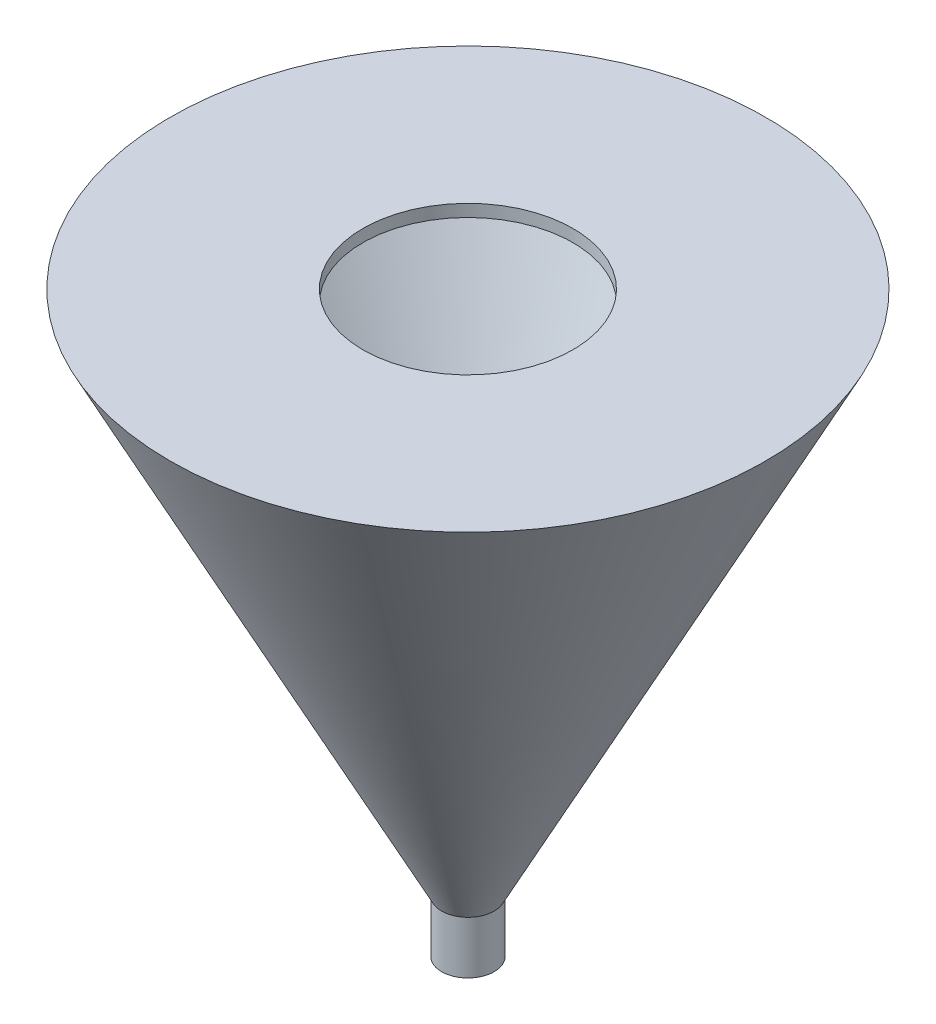
ISO-10303-21;
HEADER;
FILE_DESCRIPTION(('STEP AP214'),'2;1');
FILE_NAME('part.step','',(''),(''),'','','');
FILE_SCHEMA(('AUTOMOTIVE_DESIGN { 1 0 10303 214 1 1 1 1 }'));
ENDSEC;
DATA;
#1=APPLICATION_CONTEXT('core data for automotive mechanical design processes');
#2=APPLICATION_PROTOCOL_DEFINITION('international standard','automotive_design',2000,#1);
#3=PRODUCT_CONTEXT('',#1,'mechanical');
#4=PRODUCT('Part','Part','',(#3));
#5=PRODUCT_RELATED_PRODUCT_CATEGORY('part','',(#4));
#6=PRODUCT_DEFINITION_FORMATION('','',#4);
#7=PRODUCT_DEFINITION_CONTEXT('part definition',#1,'design');
#8=PRODUCT_DEFINITION('design','',#6,#7);
#9=PRODUCT_DEFINITION_SHAPE('','',#8);
#10=(LENGTH_UNIT() NAMED_UNIT(*) SI_UNIT(.MILLI.,.METRE.));
#11=(NAMED_UNIT(*) PLANE_ANGLE_UNIT() SI_UNIT($,.RADIAN.));
#12=(NAMED_UNIT(*) SI_UNIT($,.STERADIAN.) SOLID_ANGLE_UNIT());
#13=UNCERTAINTY_MEASURE_WITH_UNIT(LENGTH_MEASURE(1.E-05),#10,'distance_accuracy_value','');
#14=(GEOMETRIC_REPRESENTATION_CONTEXT(3) GLOBAL_UNCERTAINTY_ASSIGNED_CONTEXT((#13)) GLOBAL_UNIT_ASSIGNED_CONTEXT((#10,
#11,#12)) REPRESENTATION_CONTEXT('',''));
#15=CARTESIAN_POINT('',(0.,0.,0.));
#16=DIRECTION('',(0.,0.,1.));
#17=DIRECTION('',(1.,0.,0.));
#18=AXIS2_PLACEMENT_3D('',#15,#16,#17);
#19=CARTESIAN_POINT('',(0.,51.2913461986501,0.));
#20=DIRECTION('',(0.,1.,0.));
#21=DIRECTION('',(0.,0.,1.));
#22=AXIS2_PLACEMENT_3D('',#19,#20,#21);
#23=CYLINDRICAL_SURFACE('',#22,4.5);
#24=CARTESIAN_POINT('',(0.,16.8184876151176,0.));
#25=DIRECTION('',(0.,1.,0.));
#26=DIRECTION('',(0.,0.,1.));
#27=AXIS2_PLACEMENT_3D('',#24,#25,#26);
#28=CIRCLE('',#27,4.5);
#29=CARTESIAN_POINT('',(0.,16.8184876151176,4.5));
#30=VERTEX_POINT('',#29);
#31=EDGE_CURVE('E10',#30,#30,#28,.T.);
#32=ORIENTED_EDGE('',*,*,#31,.T.);
#33=EDGE_LOOP('',(#32));
#34=FACE_BOUND('',#33,.T.);
#35=CARTESIAN_POINT('',(0.,0.,0.));
#36=DIRECTION('',(0.,1.,0.));
#37=DIRECTION('',(0.,0.,1.));
#38=AXIS2_PLACEMENT_3D('',#35,#36,#37);
#39=CIRCLE('',#38,4.5);
#40=CARTESIAN_POINT('',(0.,0.,4.5));
#41=VERTEX_POINT('',#40);
#42=EDGE_CURVE('E72',#41,#41,#39,.T.);
#43=ORIENTED_EDGE('',*,*,#42,.F.);
#44=EDGE_LOOP('',(#43));
#45=FACE_BOUND('',#44,.T.);
#46=ADVANCED_FACE('F37',(#34,#45),#23,.F.);
#47=CARTESIAN_POINT('',(0.,16.8184876151176,0.));
#48=DIRECTION('',(0.,1.,0.));
#49=DIRECTION('',(0.,0.,1.));
#50=AXIS2_PLACEMENT_3D('',#47,#48,#49);
#51=CONICAL_SURFACE('',#50,4.5,0.476891867665535);
#52=CARTESIAN_POINT('',(0.,161.5,0.));
#53=DIRECTION('',(0.,1.,0.));
#54=DIRECTION('',(0.,0.,1.));
#55=AXIS2_PLACEMENT_3D('',#52,#53,#54);
#56=CIRCLE('',#55,79.2521147321893);
#57=CARTESIAN_POINT('',(0.,161.5,79.2521147321893));
#58=VERTEX_POINT('',#57);
#59=EDGE_CURVE('E44',#58,#58,#56,.T.);
#60=CARTESIAN_POINT('',(0.,161.5,79.2521147321893));
#61=CARTESIAN_POINT('',(0.,159.992900912657,78.4734468703956));
#62=CARTESIAN_POINT('',(0.,158.485801825315,77.694779008602));
#63=CARTESIAN_POINT('',(0.,155.47160365063,76.1374432850147));
#64=CARTESIAN_POINT('',(0.,153.964504563287,75.3587754232211));
#65=CARTESIAN_POINT('',(0.,150.950306388602,73.8014396996338));
#66=CARTESIAN_POINT('',(0.,149.44320730126,73.0227718378402));
#67=CARTESIAN_POINT('',(0.,146.429009126575,71.4654361142529));
#68=CARTESIAN_POINT('',(0.,144.921910039232,70.6867682524592));
#69=CARTESIAN_POINT('',(0.,141.907711864547,69.129432528872));
#70=CARTESIAN_POINT('',(0.,140.400612777205,68.3507646670784));
#71=CARTESIAN_POINT('',(0.,137.38641460252,66.7934289434911));
#72=CARTESIAN_POINT('',(0.,135.879315515177,66.0147610816974));
#73=CARTESIAN_POINT('',(0.,132.865117340492,64.4574253581101));
#74=CARTESIAN_POINT('',(0.,131.358018253149,63.6787574963165));
#75=CARTESIAN_POINT('',(0.,128.343820078464,62.1214217727292));
#76=CARTESIAN_POINT('',(0.,126.836720991122,61.3427539109356));
#77=CARTESIAN_POINT('',(0.,123.822522816437,59.7854181873483));
#78=CARTESIAN_POINT('',(0.,122.315423729094,59.0067503255547));
#79=CARTESIAN_POINT('',(0.,119.301225554409,57.4494146019674));
#80=CARTESIAN_POINT('',(0.,117.794126467067,56.6707467401738));
#81=CARTESIAN_POINT('',(0.,114.779928292382,55.1134110165865));
#82=CARTESIAN_POINT('',(0.,113.272829205039,54.3347431547928));
#83=CARTESIAN_POINT('',(0.,110.258631030354,52.7774074312056));
#84=CARTESIAN_POINT('',(0.,108.751531943012,51.9987395694119));
#85=CARTESIAN_POINT('',(0.,105.737333768327,50.4414038458247));
#86=CARTESIAN_POINT('',(0.,104.230234680984,49.662735984031));
#87=CARTESIAN_POINT('',(0.,101.216036506299,48.1054002604437));
#88=CARTESIAN_POINT('',(0.,99.7089374189565,47.3267323986501));
#89=CARTESIAN_POINT('',(0.,96.6947392442714,45.7693966750628));
#90=CARTESIAN_POINT('',(0.,95.1876401569289,44.9907288132692));
#91=CARTESIAN_POINT('',(0.,92.1734419822438,43.4333930896819));
#92=CARTESIAN_POINT('',(0.,90.6663428949013,42.6547252278883));
#93=CARTESIAN_POINT('',(0.,87.6521447202163,41.097389504301));
#94=CARTESIAN_POINT('',(0.,86.1450456328737,40.3187216425074));
#95=CARTESIAN_POINT('',(0.,83.1308474581887,38.7613859189201));
#96=CARTESIAN_POINT('',(0.,81.6237483708462,37.9827180571264));
#97=CARTESIAN_POINT('',(0.,78.6095501961611,36.4253823335392));
#98=CARTESIAN_POINT('',(0.,77.1024511088186,35.6467144717455));
#99=CARTESIAN_POINT('',(0.,74.0882529341335,34.0893787481582));
#100=CARTESIAN_POINT('',(0.,72.581153846791,33.3107108863646));
#101=CARTESIAN_POINT('',(0.,69.566955672106,31.7533751627773));
#102=CARTESIAN_POINT('',(0.,68.0598565847635,30.9747073009837));
#103=CARTESIAN_POINT('',(0.,65.0456584100784,29.4173715773964));
#104=CARTESIAN_POINT('',(0.,63.5385593227359,28.6387037156028));
#105=CARTESIAN_POINT('',(0.,60.5243611480508,27.0813679920155));
#106=CARTESIAN_POINT('',(0.,59.0172620607083,26.3027001302219));
#107=CARTESIAN_POINT('',(0.,56.0030638860233,24.7453644066346));
#108=CARTESIAN_POINT('',(0.,54.4959647986807,23.966696544841));
#109=CARTESIAN_POINT('',(0.,51.4817666239957,22.4093608212537));
#110=CARTESIAN_POINT('',(0.,49.9746675366532,21.63069295946));
#111=CARTESIAN_POINT('',(0.,46.9604693619681,20.0733572358728));
#112=CARTESIAN_POINT('',(0.,45.4533702746256,19.2946893740791));
#113=CARTESIAN_POINT('',(0.,42.4391720999405,17.7373536504918));
#114=CARTESIAN_POINT('',(0.,40.932073012598,16.9586857886982));
#115=CARTESIAN_POINT('',(0.,37.917874837913,15.4013500651109));
#116=CARTESIAN_POINT('',(0.,36.4107757505704,14.6226822033173));
#117=CARTESIAN_POINT('',(0.,33.3965775758854,13.06534647973));
#118=CARTESIAN_POINT('',(0.,31.8894784885429,12.2866786179364));
#119=CARTESIAN_POINT('',(0.,28.8752803138578,10.7293428943491));
#120=CARTESIAN_POINT('',(0.,27.3681812265153,9.95067503255547));
#121=CARTESIAN_POINT('',(0.,24.3539830518302,8.39333930896819));
#122=CARTESIAN_POINT('',(0.,22.8468839644877,7.61467144717455));
#123=CARTESIAN_POINT('',(0.,19.8326857898027,6.05733572358728));
#124=CARTESIAN_POINT('',(0.,18.3255867024601,5.27866786179364));
#125=CARTESIAN_POINT('',(0.,16.8184876151176,4.5));
#126=B_SPLINE_CURVE_WITH_KNOTS('',3,(#60,#61,#62,#63,#64,#65,#66,#67,#68,#69,#70,#71,#72,#73,
#74,#75,#76,#77,#78,#79,#80,#81,#82,#83,#84,#85,#86,#87,#88,#89,#90,#91,#92,#93,#94,#95,#96,#97,
#98,#99,#100,#101,#102,#103,#104,#105,#106,#107,#108,#109,#110,#111,#112,#113,#114,#115,#116,
#117,#118,#119,#120,#121,#122,#123,#124,#125),.UNSPECIFIED.,.F.,.F.,(4,2,2,2,2,2,2,2,2,2,2,2,2,
2,2,2,2,2,2,2,2,2,2,2,2,2,2,2,2,2,2,2,4),(0.,5.08911010713371,10.1782202142674,15.2673303214011,
20.3564404285349,25.4455505356686,30.5346606428023,35.623770749936,40.7128808570697,
45.8019909642034,50.8911010713371,55.9802111784709,61.0693212856046,66.1584313927383,
71.247541499872,76.3366516070057,81.4257617141394,86.5148718212731,91.6039819284069,
96.6930920355406,101.782202142674,106.871312249808,111.960422356942,117.049532464075,
122.138642571209,127.227752678343,132.316862785477,137.40597289261,142.495082999744,
147.584193106878,152.673303214011,157.762413321145,162.851523428279),.UNSPECIFIED.);
#127=EDGE_CURVE('BSEAM81',#58,#30,#126,.T.);
#128=ORIENTED_EDGE('',*,*,#59,.T.);
#129=ORIENTED_EDGE('',*,*,#31,.F.);
#130=ORIENTED_EDGE('',*,*,#127,.T.);
#131=ORIENTED_EDGE('',*,*,#127,.F.);
#132=EDGE_LOOP('',(#128,#130,#129,#131));
#133=FACE_BOUND('',#132,.T.);
#134=ADVANCED_FACE('F81',(#133),#51,.F.);
#135=CARTESIAN_POINT('',(-30.,161.5,0.));
#136=DIRECTION('',(0.,-1.,0.));
#137=DIRECTION('',(0.,0.,-1.));
#138=AXIS2_PLACEMENT_3D('',#135,#136,#137);
#139=PLANE('',#138);
#140=CARTESIAN_POINT('',(0.,161.5,0.));
#141=DIRECTION('',(0.,1.,0.));
#142=DIRECTION('',(0.,0.,1.));
#143=AXIS2_PLACEMENT_3D('',#140,#141,#142);
#144=CIRCLE('',#143,30.);
#145=CARTESIAN_POINT('',(0.,161.5,30.));
#146=VERTEX_POINT('',#145);
#147=EDGE_CURVE('E49',#146,#146,#144,.T.);
#148=ORIENTED_EDGE('',*,*,#147,.T.);
#149=EDGE_LOOP('',(#148));
#150=FACE_BOUND('',#149,.T.);
#151=ORIENTED_EDGE('',*,*,#59,.F.);
#152=EDGE_LOOP('',(#151));
#153=FACE_BOUND('',#152,.T.);
#154=ADVANCED_FACE('F85',(#150,#153),#139,.T.);
#155=CARTESIAN_POINT('',(0.,51.2913461986501,0.));
#156=DIRECTION('',(0.,1.,0.));
#157=DIRECTION('',(0.,0.,1.));
#158=AXIS2_PLACEMENT_3D('',#155,#156,#157);
#159=CYLINDRICAL_SURFACE('',#158,30.);
#160=CARTESIAN_POINT('',(0.,165.,0.));
#161=DIRECTION('',(0.,1.,0.));
#162=DIRECTION('',(0.,0.,1.));
#163=AXIS2_PLACEMENT_3D('',#160,#161,#162);
#164=CIRCLE('',#163,30.);
#165=CARTESIAN_POINT('',(0.,165.,30.));
#166=VERTEX_POINT('',#165);
#167=EDGE_CURVE('E54',#166,#166,#164,.T.);
#168=ORIENTED_EDGE('',*,*,#167,.T.);
#169=EDGE_LOOP('',(#168));
#170=FACE_BOUND('',#169,.T.);
#171=ORIENTED_EDGE('',*,*,#147,.F.);
#172=EDGE_LOOP('',(#171));
#173=FACE_BOUND('',#172,.T.);
#174=ADVANCED_FACE('F89',(#170,#173),#159,.F.);
#175=CARTESIAN_POINT('',(-85.,165.,0.));
#176=DIRECTION('',(0.,1.,0.));
#177=DIRECTION('',(0.,0.,1.));
#178=AXIS2_PLACEMENT_3D('',#175,#176,#177);
#179=PLANE('',#178);
#180=CARTESIAN_POINT('',(0.,165.,0.));
#181=DIRECTION('',(0.,1.,0.));
#182=DIRECTION('',(0.,0.,1.));
#183=AXIS2_PLACEMENT_3D('',#180,#181,#182);
#184=CIRCLE('',#183,85.);
#185=CARTESIAN_POINT('',(0.,165.,85.));
#186=VERTEX_POINT('',#185);
#187=EDGE_CURVE('E60',#186,#186,#184,.T.);
#188=ORIENTED_EDGE('',*,*,#187,.T.);
#189=EDGE_LOOP('',(#188));
#190=FACE_BOUND('',#189,.T.);
#191=ORIENTED_EDGE('',*,*,#167,.F.);
#192=EDGE_LOOP('',(#191));
#193=FACE_BOUND('',#192,.T.);
#194=ADVANCED_FACE('F96',(#190,#193),#179,.T.);
#195=CARTESIAN_POINT('',(0.,165.,0.));
#196=DIRECTION('',(0.,1.,0.));
#197=DIRECTION('',(0.,0.,1.));
#198=AXIS2_PLACEMENT_3D('',#195,#196,#197);
#199=CONICAL_SURFACE('',#198,85.,0.476891867665535);
#200=CARTESIAN_POINT('',(0.,15.,0.));
#201=DIRECTION('',(0.,1.,0.));
#202=DIRECTION('',(0.,0.,1.));
#203=AXIS2_PLACEMENT_3D('',#200,#201,#202);
#204=CIRCLE('',#203,7.5);
#205=CARTESIAN_POINT('',(0.,15.,7.50000000000001));
#206=VERTEX_POINT('',#205);
#207=EDGE_CURVE('E64',#206,#206,#204,.T.);
#208=CARTESIAN_POINT('',(0.,15.,7.50000000000001));
#209=CARTESIAN_POINT('',(0.,16.5625,8.30729166666668));
#210=CARTESIAN_POINT('',(0.,18.125,9.11458333333336));
#211=CARTESIAN_POINT('',(0.,21.25,10.7291666666667));
#212=CARTESIAN_POINT('',(0.,22.8125,11.5364583333334));
#213=CARTESIAN_POINT('',(0.,25.9375,13.1510416666667));
#214=CARTESIAN_POINT('',(0.,27.5,13.9583333333333));
#215=CARTESIAN_POINT('',(0.,30.625,15.5729166666667));
#216=CARTESIAN_POINT('',(0.,32.1875,16.3802083333333));
#217=CARTESIAN_POINT('',(0.,35.3125,17.9947916666667));
#218=CARTESIAN_POINT('',(0.,36.875,18.8020833333333));
#219=CARTESIAN_POINT('',(0.,40.,20.4166666666667));
#220=CARTESIAN_POINT('',(0.,41.5625,21.2239583333333));
#221=CARTESIAN_POINT('',(0.,44.6875,22.8385416666667));
#222=CARTESIAN_POINT('',(0.,46.25,23.6458333333333));
#223=CARTESIAN_POINT('',(0.,49.375,25.2604166666667));
#224=CARTESIAN_POINT('',(0.,50.9375,26.0677083333333));
#225=CARTESIAN_POINT('',(0.,54.0625,27.6822916666667));
#226=CARTESIAN_POINT('',(0.,55.625,28.4895833333333));
#227=CARTESIAN_POINT('',(0.,58.75,30.1041666666667));
#228=CARTESIAN_POINT('',(0.,60.3125,30.9114583333333));
#229=CARTESIAN_POINT('',(0.,63.4375,32.5260416666667));
#230=CARTESIAN_POINT('',(0.,65.,33.3333333333333));
#231=CARTESIAN_POINT('',(0.,68.125,34.9479166666667));
#232=CARTESIAN_POINT('',(0.,69.6875,35.7552083333333));
#233=CARTESIAN_POINT('',(0.,72.8125,37.3697916666667));
#234=CARTESIAN_POINT('',(0.,74.375,38.1770833333333));
#235=CARTESIAN_POINT('',(0.,77.5,39.7916666666667));
#236=CARTESIAN_POINT('',(0.,79.0625,40.5989583333333));
#237=CARTESIAN_POINT('',(0.,82.1875,42.2135416666667));
#238=CARTESIAN_POINT('',(0.,83.75,43.0208333333333));
#239=CARTESIAN_POINT('',(0.,86.875,44.6354166666667));
#240=CARTESIAN_POINT('',(0.,88.4375,45.4427083333333));
#241=CARTESIAN_POINT('',(0.,91.5625,47.0572916666667));
#242=CARTESIAN_POINT('',(0.,93.125,47.8645833333333));
#243=CARTESIAN_POINT('',(0.,96.25,49.4791666666667));
#244=CARTESIAN_POINT('',(0.,97.8125,50.2864583333333));
#245=CARTESIAN_POINT('',(0.,100.9375,51.9010416666667));
#246=CARTESIAN_POINT('',(0.,102.5,52.7083333333333));
#247=CARTESIAN_POINT('',(0.,105.625,54.3229166666667));
#248=CARTESIAN_POINT('',(0.,107.1875,55.1302083333333));
#249=CARTESIAN_POINT('',(0.,110.3125,56.7447916666667));
#250=CARTESIAN_POINT('',(0.,111.875,57.5520833333333));
#251=CARTESIAN_POINT('',(0.,115.,59.1666666666667));
#252=CARTESIAN_POINT('',(0.,116.5625,59.9739583333333));
#253=CARTESIAN_POINT('',(0.,119.6875,61.5885416666667));
#254=CARTESIAN_POINT('',(0.,121.25,62.3958333333333));
#255=CARTESIAN_POINT('',(0.,124.375,64.0104166666667));
#256=CARTESIAN_POINT('',(0.,125.9375,64.8177083333333));
#257=CARTESIAN_POINT('',(0.,129.0625,66.4322916666667));
#258=CARTESIAN_POINT('',(0.,130.625,67.2395833333333));
#259=CARTESIAN_POINT('',(0.,133.75,68.8541666666667));
#260=CARTESIAN_POINT('',(0.,135.3125,69.6614583333333));
#261=CARTESIAN_POINT('',(0.,138.4375,71.2760416666667));
#262=CARTESIAN_POINT('',(0.,140.,72.0833333333333));
#263=CARTESIAN_POINT('',(0.,143.125,73.6979166666667));
#264=CARTESIAN_POINT('',(0.,144.6875,74.5052083333333));
#265=CARTESIAN_POINT('',(0.,147.8125,76.1197916666667));
#266=CARTESIAN_POINT('',(0.,149.375,76.9270833333333));
#267=CARTESIAN_POINT('',(0.,152.5,78.5416666666667));
#268=CARTESIAN_POINT('',(0.,154.0625,79.3489583333333));
#269=CARTESIAN_POINT('',(0.,157.1875,80.9635416666667));
#270=CARTESIAN_POINT('',(0.,158.75,81.7708333333333));
#271=CARTESIAN_POINT('',(0.,161.875,83.3854166666667));
#272=CARTESIAN_POINT('',(0.,163.4375,84.1927083333333));
#273=CARTESIAN_POINT('',(0.,165.,85.));
#274=B_SPLINE_CURVE_WITH_KNOTS('',3,(#208,#209,#210,#211,#212,#213,#214,#215,#216,#217,#218,
#219,#220,#221,#222,#223,#224,#225,#226,#227,#228,#229,#230,#231,#232,#233,#234,#235,#236,#237,
#238,#239,#240,#241,#242,#243,#244,#245,#246,#247,#248,#249,#250,#251,#252,#253,#254,#255,#256,
#257,#258,#259,#260,#261,#262,#263,#264,#265,#266,#267,#268,#269,#270,#271,#272,#273),
.UNSPECIFIED.,.F.,.F.,(4,2,2,2,2,2,2,2,2,2,2,2,2,2,2,2,2,2,2,2,2,2,2,2,2,2,2,2,2,2,2,2,4),(0.,
5.27618562653222,10.5523712530644,15.8285568795966,21.1047425061288,26.380928132661,
31.6571137591932,36.9332993857254,42.2094850122576,47.4856706387898,52.761856265322,
58.0380418918542,63.3142275183864,68.5904131449186,73.8665987714508,79.142784397983,
84.4189700245152,89.6951556510474,94.9713412775796,100.247526904112,105.523712530644,
110.799898157176,116.076083783708,121.352269410241,126.628455036773,131.904640663305,
137.180826289837,142.457011916369,147.733197542902,153.009383169434,158.285568795966,
163.561754422498,168.83794004903),.UNSPECIFIED.);
#275=EDGE_CURVE('BSEAM100',#206,#186,#274,.T.);
#276=ORIENTED_EDGE('',*,*,#207,.T.);
#277=ORIENTED_EDGE('',*,*,#187,.F.);
#278=ORIENTED_EDGE('',*,*,#275,.T.);
#279=ORIENTED_EDGE('',*,*,#275,.F.);
#280=EDGE_LOOP('',(#276,#278,#277,#279));
#281=FACE_BOUND('',#280,.T.);
#282=ADVANCED_FACE('F100',(#281),#199,.T.);
#283=CARTESIAN_POINT('',(0.,51.2913461986501,0.));
#284=DIRECTION('',(0.,1.,0.));
#285=DIRECTION('',(0.,0.,1.));
#286=AXIS2_PLACEMENT_3D('',#283,#284,#285);
#287=CYLINDRICAL_SURFACE('',#286,7.5);
#288=CARTESIAN_POINT('',(0.,0.,0.));
#289=DIRECTION('',(0.,1.,0.));
#290=DIRECTION('',(0.,0.,1.));
#291=AXIS2_PLACEMENT_3D('',#288,#289,#290);
#292=CIRCLE('',#291,7.5);
#293=CARTESIAN_POINT('',(0.,0.,7.5));
#294=VERTEX_POINT('',#293);
#295=EDGE_CURVE('E68',#294,#294,#292,.T.);
#296=ORIENTED_EDGE('',*,*,#295,.T.);
#297=EDGE_LOOP('',(#296));
#298=FACE_BOUND('',#297,.T.);
#299=ORIENTED_EDGE('',*,*,#207,.F.);
#300=EDGE_LOOP('',(#299));
#301=FACE_BOUND('',#300,.T.);
#302=ADVANCED_FACE('F104',(#298,#301),#287,.T.);
#303=CARTESIAN_POINT('',(-7.5,0.,0.));
#304=DIRECTION('',(0.,-1.,0.));
#305=DIRECTION('',(0.,0.,-1.));
#306=AXIS2_PLACEMENT_3D('',#303,#304,#305);
#307=PLANE('',#306);
#308=ORIENTED_EDGE('',*,*,#42,.T.);
#309=EDGE_LOOP('',(#308));
#310=FACE_BOUND('',#309,.T.);
#311=ORIENTED_EDGE('',*,*,#295,.F.);
#312=EDGE_LOOP('',(#311));
#313=FACE_BOUND('',#312,.T.);
#314=ADVANCED_FACE('F77',(#310,#313),#307,.T.);
#315=CLOSED_SHELL('',(#46,#134,#154,#174,#194,#282,#302,#314));
#316=MANIFOLD_SOLID_BREP('B2',#315);
#317=ADVANCED_BREP_SHAPE_REPRESENTATION('',(#18,#316),#14);
#318=SHAPE_DEFINITION_REPRESENTATION(#9,#317);
ENDSEC;
END-ISO-10303-21;
